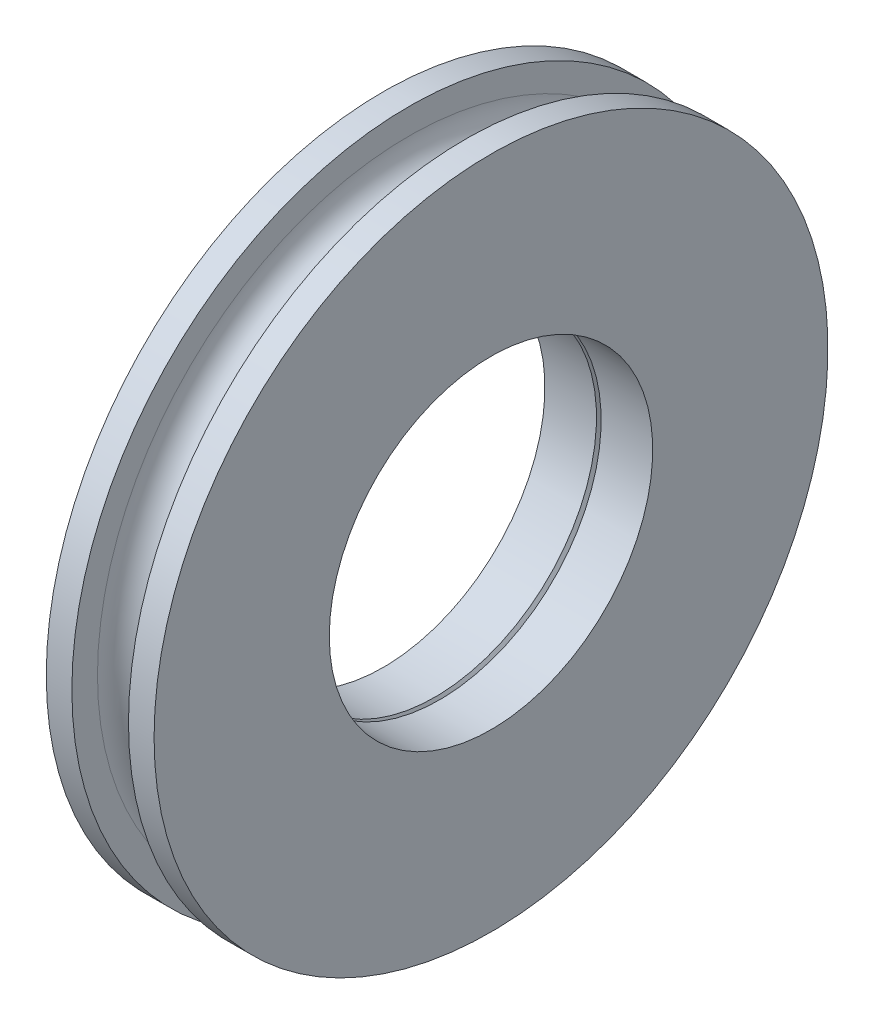
ISO-10303-21;
HEADER;
FILE_DESCRIPTION(('STEP AP214'),'2;1');
FILE_NAME('part.step','',(''),(''),'','','');
FILE_SCHEMA(('AUTOMOTIVE_DESIGN { 1 0 10303 214 1 1 1 1 }'));
ENDSEC;
DATA;
#1=APPLICATION_CONTEXT('core data for automotive mechanical design processes');
#2=APPLICATION_PROTOCOL_DEFINITION('international standard','automotive_design',2000,#1);
#3=PRODUCT_CONTEXT('',#1,'mechanical');
#4=PRODUCT('Part','Part','',(#3));
#5=PRODUCT_RELATED_PRODUCT_CATEGORY('part','',(#4));
#6=PRODUCT_DEFINITION_FORMATION('','',#4);
#7=PRODUCT_DEFINITION_CONTEXT('part definition',#1,'design');
#8=PRODUCT_DEFINITION('design','',#6,#7);
#9=PRODUCT_DEFINITION_SHAPE('','',#8);
#10=(LENGTH_UNIT() NAMED_UNIT(*) SI_UNIT(.MILLI.,.METRE.));
#11=(NAMED_UNIT(*) PLANE_ANGLE_UNIT() SI_UNIT($,.RADIAN.));
#12=(NAMED_UNIT(*) SI_UNIT($,.STERADIAN.) SOLID_ANGLE_UNIT());
#13=UNCERTAINTY_MEASURE_WITH_UNIT(LENGTH_MEASURE(1.E-05),#10,'distance_accuracy_value','');
#14=(GEOMETRIC_REPRESENTATION_CONTEXT(3) GLOBAL_UNCERTAINTY_ASSIGNED_CONTEXT((#13)) GLOBAL_UNIT_ASSIGNED_CONTEXT((#10,
#11,#12)) REPRESENTATION_CONTEXT('',''));
#15=CARTESIAN_POINT('',(0.,0.,0.));
#16=DIRECTION('',(0.,0.,1.));
#17=DIRECTION('',(1.,0.,0.));
#18=AXIS2_PLACEMENT_3D('',#15,#16,#17);
#19=CARTESIAN_POINT('',(-4.,12.,0.));
#20=DIRECTION('',(-1.,0.,0.));
#21=DIRECTION('',(0.,0.,1.));
#22=AXIS2_PLACEMENT_3D('',#19,#20,#21);
#23=PLANE('',#22);
#24=CARTESIAN_POINT('',(-4.,0.,0.));
#25=DIRECTION('',(-1.,0.,0.));
#26=DIRECTION('',(0.,0.,1.));
#27=AXIS2_PLACEMENT_3D('',#24,#25,#26);
#28=CIRCLE('',#27,25.);
#29=CARTESIAN_POINT('',(-4.,0.,25.));
#30=VERTEX_POINT('',#29);
#31=EDGE_CURVE('E67',#30,#30,#28,.T.);
#32=ORIENTED_EDGE('',*,*,#31,.T.);
#33=EDGE_LOOP('',(#32));
#34=FACE_BOUND('',#33,.T.);
#35=CARTESIAN_POINT('',(-4.,0.,0.));
#36=DIRECTION('',(-1.,0.,0.));
#37=DIRECTION('',(0.,0.,1.));
#38=AXIS2_PLACEMENT_3D('',#35,#36,#37);
#39=CIRCLE('',#38,12.);
#40=CARTESIAN_POINT('',(-4.,0.,12.));
#41=VERTEX_POINT('',#40);
#42=EDGE_CURVE('E10',#41,#41,#39,.T.);
#43=ORIENTED_EDGE('',*,*,#42,.F.);
#44=EDGE_LOOP('',(#43));
#45=FACE_BOUND('',#44,.T.);
#46=ADVANCED_FACE('F30',(#34,#45),#23,.T.);
#47=CARTESIAN_POINT('',(3.,0.,0.));
#48=DIRECTION('',(-1.,0.,0.));
#49=DIRECTION('',(0.,0.,1.));
#50=AXIS2_PLACEMENT_3D('',#47,#48,#49);
#51=CYLINDRICAL_SURFACE('',#50,12.);
#52=ORIENTED_EDGE('',*,*,#42,.T.);
#53=EDGE_LOOP('',(#52));
#54=FACE_BOUND('',#53,.T.);
#55=CARTESIAN_POINT('',(-0.173205080756889,0.,0.));
#56=DIRECTION('',(-1.,0.,0.));
#57=DIRECTION('',(0.,0.,1.));
#58=AXIS2_PLACEMENT_3D('',#55,#56,#57);
#59=CIRCLE('',#58,12.);
#60=CARTESIAN_POINT('',(-0.173205080756889,0.,12.));
#61=VERTEX_POINT('',#60);
#62=EDGE_CURVE('E36',#61,#61,#59,.T.);
#63=ORIENTED_EDGE('',*,*,#62,.F.);
#64=EDGE_LOOP('',(#63));
#65=FACE_BOUND('',#64,.T.);
#66=ADVANCED_FACE('F85',(#54,#65),#51,.F.);
#67=CARTESIAN_POINT('',(0.,0.,0.));
#68=DIRECTION('',(1.,0.,0.));
#69=DIRECTION('',(0.,0.,-1.));
#70=AXIS2_PLACEMENT_3D('',#67,#68,#69);
#71=CONICAL_SURFACE('',#70,12.3,1.0471975511966);
#72=ORIENTED_EDGE('',*,*,#62,.T.);
#73=EDGE_LOOP('',(#72));
#74=FACE_BOUND('',#73,.T.);
#75=CARTESIAN_POINT('',(0.,0.,0.));
#76=DIRECTION('',(-1.,0.,0.));
#77=DIRECTION('',(0.,0.,1.));
#78=AXIS2_PLACEMENT_3D('',#75,#76,#77);
#79=CIRCLE('',#78,12.3);
#80=CARTESIAN_POINT('',(0.,0.,12.3));
#81=VERTEX_POINT('',#80);
#82=EDGE_CURVE('E40',#81,#81,#79,.T.);
#83=ORIENTED_EDGE('',*,*,#82,.F.);
#84=EDGE_LOOP('',(#83));
#85=FACE_BOUND('',#84,.T.);
#86=ADVANCED_FACE('F89',(#74,#85),#71,.F.);
#87=CARTESIAN_POINT('',(0.173205080756888,0.,0.));
#88=DIRECTION('',(-1.,0.,0.));
#89=DIRECTION('',(0.,0.,1.));
#90=AXIS2_PLACEMENT_3D('',#87,#88,#89);
#91=CONICAL_SURFACE('',#90,12.,1.0471975511966);
#92=ORIENTED_EDGE('',*,*,#82,.T.);
#93=EDGE_LOOP('',(#92));
#94=FACE_BOUND('',#93,.T.);
#95=CARTESIAN_POINT('',(0.173205080756888,0.,0.));
#96=DIRECTION('',(-1.,0.,0.));
#97=DIRECTION('',(0.,0.,1.));
#98=AXIS2_PLACEMENT_3D('',#95,#96,#97);
#99=CIRCLE('',#98,12.);
#100=CARTESIAN_POINT('',(0.173205080756888,0.,12.));
#101=VERTEX_POINT('',#100);
#102=EDGE_CURVE('E44',#101,#101,#99,.T.);
#103=ORIENTED_EDGE('',*,*,#102,.F.);
#104=EDGE_LOOP('',(#103));
#105=FACE_BOUND('',#104,.T.);
#106=ADVANCED_FACE('F93',(#94,#105),#91,.F.);
#107=CARTESIAN_POINT('',(3.,0.,0.));
#108=DIRECTION('',(-1.,0.,0.));
#109=DIRECTION('',(0.,0.,1.));
#110=AXIS2_PLACEMENT_3D('',#107,#108,#109);
#111=CYLINDRICAL_SURFACE('',#110,12.);
#112=ORIENTED_EDGE('',*,*,#102,.T.);
#113=EDGE_LOOP('',(#112));
#114=FACE_BOUND('',#113,.T.);
#115=CARTESIAN_POINT('',(4.,0.,0.));
#116=DIRECTION('',(-1.,0.,0.));
#117=DIRECTION('',(0.,0.,1.));
#118=AXIS2_PLACEMENT_3D('',#115,#116,#117);
#119=CIRCLE('',#118,12.);
#120=CARTESIAN_POINT('',(4.,0.,12.));
#121=VERTEX_POINT('',#120);
#122=EDGE_CURVE('E49',#121,#121,#119,.T.);
#123=ORIENTED_EDGE('',*,*,#122,.F.);
#124=EDGE_LOOP('',(#123));
#125=FACE_BOUND('',#124,.T.);
#126=ADVANCED_FACE('F99',(#114,#125),#111,.F.);
#127=CARTESIAN_POINT('',(4.,25.,0.));
#128=DIRECTION('',(1.,0.,0.));
#129=DIRECTION('',(0.,0.,-1.));
#130=AXIS2_PLACEMENT_3D('',#127,#128,#129);
#131=PLANE('',#130);
#132=ORIENTED_EDGE('',*,*,#122,.T.);
#133=EDGE_LOOP('',(#132));
#134=FACE_BOUND('',#133,.T.);
#135=CARTESIAN_POINT('',(4.,0.,0.));
#136=DIRECTION('',(-1.,0.,0.));
#137=DIRECTION('',(0.,0.,1.));
#138=AXIS2_PLACEMENT_3D('',#135,#136,#137);
#139=CIRCLE('',#138,25.);
#140=CARTESIAN_POINT('',(4.,0.,25.));
#141=VERTEX_POINT('',#140);
#142=EDGE_CURVE('E52',#141,#141,#139,.T.);
#143=ORIENTED_EDGE('',*,*,#142,.F.);
#144=EDGE_LOOP('',(#143));
#145=FACE_BOUND('',#144,.T.);
#146=ADVANCED_FACE('F103',(#134,#145),#131,.T.);
#147=CARTESIAN_POINT('',(3.,0.,0.));
#148=DIRECTION('',(-1.,0.,0.));
#149=DIRECTION('',(0.,0.,1.));
#150=AXIS2_PLACEMENT_3D('',#147,#148,#149);
#151=CYLINDRICAL_SURFACE('',#150,25.);
#152=ORIENTED_EDGE('',*,*,#142,.T.);
#153=EDGE_LOOP('',(#152));
#154=FACE_BOUND('',#153,.T.);
#155=CARTESIAN_POINT('',(2.1,0.,0.));
#156=DIRECTION('',(-1.,0.,0.));
#157=DIRECTION('',(0.,0.,1.));
#158=AXIS2_PLACEMENT_3D('',#155,#156,#157);
#159=CIRCLE('',#158,25.);
#160=CARTESIAN_POINT('',(2.1,0.,25.));
#161=VERTEX_POINT('',#160);
#162=EDGE_CURVE('E55',#161,#161,#159,.T.);
#163=ORIENTED_EDGE('',*,*,#162,.F.);
#164=EDGE_LOOP('',(#163));
#165=FACE_BOUND('',#164,.T.);
#166=ADVANCED_FACE('F107',(#154,#165),#151,.T.);
#167=CARTESIAN_POINT('',(2.1,23.1,0.));
#168=DIRECTION('',(-1.,0.,0.));
#169=DIRECTION('',(0.,0.,1.));
#170=AXIS2_PLACEMENT_3D('',#167,#168,#169);
#171=PLANE('',#170);
#172=ORIENTED_EDGE('',*,*,#162,.T.);
#173=EDGE_LOOP('',(#172));
#174=FACE_BOUND('',#173,.T.);
#175=CARTESIAN_POINT('',(2.1,0.,0.));
#176=DIRECTION('',(-1.,0.,0.));
#177=DIRECTION('',(0.,0.,1.));
#178=AXIS2_PLACEMENT_3D('',#175,#176,#177);
#179=CIRCLE('',#178,23.1);
#180=CARTESIAN_POINT('',(2.1,0.,23.1));
#181=VERTEX_POINT('',#180);
#182=EDGE_CURVE('E58',#181,#181,#179,.T.);
#183=ORIENTED_EDGE('',*,*,#182,.F.);
#184=EDGE_LOOP('',(#183));
#185=FACE_BOUND('',#184,.T.);
#186=ADVANCED_FACE('F111',(#174,#185),#171,.T.);
#187=CARTESIAN_POINT('',(0.,0.,0.));
#188=DIRECTION('',(-1.,0.,0.));
#189=DIRECTION('',(0.,0.,1.));
#190=AXIS2_PLACEMENT_3D('',#187,#188,#189);
#191=TOROIDAL_SURFACE('',#190,23.1,2.1);
#192=ORIENTED_EDGE('',*,*,#182,.T.);
#193=EDGE_LOOP('',(#192));
#194=FACE_BOUND('',#193,.T.);
#195=CARTESIAN_POINT('',(-2.1,0.,0.));
#196=DIRECTION('',(-1.,0.,0.));
#197=DIRECTION('',(0.,0.,1.));
#198=AXIS2_PLACEMENT_3D('',#195,#196,#197);
#199=CIRCLE('',#198,23.1);
#200=CARTESIAN_POINT('',(-2.1,0.,23.1));
#201=VERTEX_POINT('',#200);
#202=EDGE_CURVE('E61',#201,#201,#199,.T.);
#203=ORIENTED_EDGE('',*,*,#202,.F.);
#204=EDGE_LOOP('',(#203));
#205=FACE_BOUND('',#204,.T.);
#206=ADVANCED_FACE('F81',(#194,#205),#191,.F.);
#207=CARTESIAN_POINT('',(-2.1,25.,0.));
#208=DIRECTION('',(1.,0.,0.));
#209=DIRECTION('',(0.,0.,-1.));
#210=AXIS2_PLACEMENT_3D('',#207,#208,#209);
#211=PLANE('',#210);
#212=ORIENTED_EDGE('',*,*,#202,.T.);
#213=EDGE_LOOP('',(#212));
#214=FACE_BOUND('',#213,.T.);
#215=CARTESIAN_POINT('',(-2.1,0.,0.));
#216=DIRECTION('',(-1.,0.,0.));
#217=DIRECTION('',(0.,0.,1.));
#218=AXIS2_PLACEMENT_3D('',#215,#216,#217);
#219=CIRCLE('',#218,25.);
#220=CARTESIAN_POINT('',(-2.1,0.,25.));
#221=VERTEX_POINT('',#220);
#222=EDGE_CURVE('E64',#221,#221,#219,.T.);
#223=ORIENTED_EDGE('',*,*,#222,.F.);
#224=EDGE_LOOP('',(#223));
#225=FACE_BOUND('',#224,.T.);
#226=ADVANCED_FACE('F75',(#214,#225),#211,.T.);
#227=CARTESIAN_POINT('',(3.,0.,0.));
#228=DIRECTION('',(-1.,0.,0.));
#229=DIRECTION('',(0.,0.,1.));
#230=AXIS2_PLACEMENT_3D('',#227,#228,#229);
#231=CYLINDRICAL_SURFACE('',#230,25.);
#232=ORIENTED_EDGE('',*,*,#222,.T.);
#233=EDGE_LOOP('',(#232));
#234=FACE_BOUND('',#233,.T.);
#235=ORIENTED_EDGE('',*,*,#31,.F.);
#236=EDGE_LOOP('',(#235));
#237=FACE_BOUND('',#236,.T.);
#238=ADVANCED_FACE('F73',(#234,#237),#231,.T.);
#239=CLOSED_SHELL('',(#46,#66,#86,#106,#126,#146,#166,#186,#206,#226,#238));
#240=MANIFOLD_SOLID_BREP('B2',#239);
#241=ADVANCED_BREP_SHAPE_REPRESENTATION('',(#18,#240),#14);
#242=SHAPE_DEFINITION_REPRESENTATION(#9,#241);
ENDSEC;
END-ISO-10303-21;
